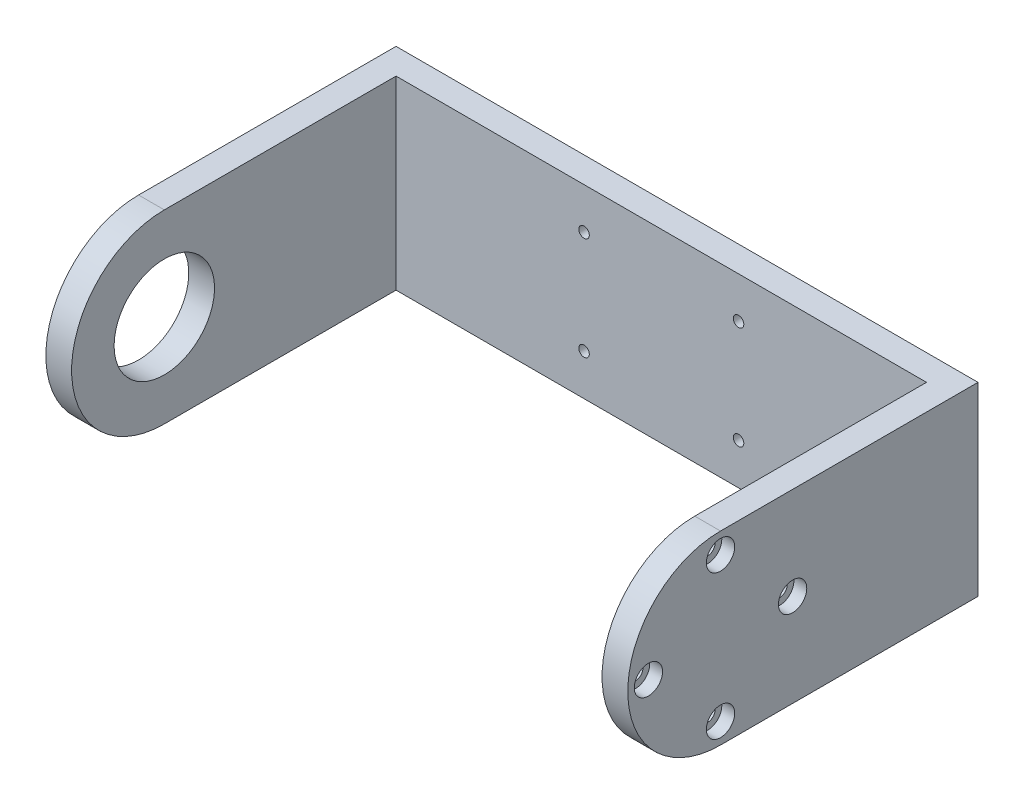
ISO-10303-21;
HEADER;
FILE_DESCRIPTION(('STEP AP214'),'2;1');
FILE_NAME('part.step','',(''),(''),'','','');
FILE_SCHEMA(('AUTOMOTIVE_DESIGN { 1 0 10303 214 1 1 1 1 }'));
ENDSEC;
DATA;
#1=APPLICATION_CONTEXT('core data for automotive mechanical design processes');
#2=APPLICATION_PROTOCOL_DEFINITION('international standard','automotive_design',2000,#1);
#3=PRODUCT_CONTEXT('',#1,'mechanical');
#4=PRODUCT('Part','Part','',(#3));
#5=PRODUCT_RELATED_PRODUCT_CATEGORY('part','',(#4));
#6=PRODUCT_DEFINITION_FORMATION('','',#4);
#7=PRODUCT_DEFINITION_CONTEXT('part definition',#1,'design');
#8=PRODUCT_DEFINITION('design','',#6,#7);
#9=PRODUCT_DEFINITION_SHAPE('','',#8);
#10=(LENGTH_UNIT() NAMED_UNIT(*) SI_UNIT(.MILLI.,.METRE.));
#11=(NAMED_UNIT(*) PLANE_ANGLE_UNIT() SI_UNIT($,.RADIAN.));
#12=(NAMED_UNIT(*) SI_UNIT($,.STERADIAN.) SOLID_ANGLE_UNIT());
#13=UNCERTAINTY_MEASURE_WITH_UNIT(LENGTH_MEASURE(1.E-05),#10,'distance_accuracy_value','');
#14=(GEOMETRIC_REPRESENTATION_CONTEXT(3) GLOBAL_UNCERTAINTY_ASSIGNED_CONTEXT((#13)) GLOBAL_UNIT_ASSIGNED_CONTEXT((#10,
#11,#12)) REPRESENTATION_CONTEXT('',''));
#15=CARTESIAN_POINT('',(0.,0.,0.));
#16=DIRECTION('',(0.,0.,1.));
#17=DIRECTION('',(1.,0.,0.));
#18=AXIS2_PLACEMENT_3D('',#15,#16,#17);
#19=CARTESIAN_POINT('',(0.,0.,-45.));
#20=DIRECTION('',(0.,0.,1.));
#21=DIRECTION('',(1.,0.,0.));
#22=AXIS2_PLACEMENT_3D('',#19,#20,#21);
#23=PLANE('',#22);
#24=CARTESIAN_POINT('',(-36.5,10.,-45.));
#25=DIRECTION('',(0.,0.,1.));
#26=DIRECTION('',(1.,0.,0.));
#27=AXIS2_PLACEMENT_3D('',#24,#25,#26);
#28=CIRCLE('',#27,1.02499999999999);
#29=CARTESIAN_POINT('',(-35.475,10.,-45.));
#30=VERTEX_POINT('',#29);
#31=EDGE_CURVE('E216',#30,#30,#28,.T.);
#32=ORIENTED_EDGE('',*,*,#31,.F.);
#33=EDGE_LOOP('',(#32));
#34=FACE_BOUND('',#33,.T.);
#35=CARTESIAN_POINT('',(-66.5,10.,-45.));
#36=DIRECTION('',(0.,0.,1.));
#37=DIRECTION('',(1.,0.,0.));
#38=AXIS2_PLACEMENT_3D('',#35,#36,#37);
#39=CIRCLE('',#38,1.025);
#40=CARTESIAN_POINT('',(-65.475,10.,-45.));
#41=VERTEX_POINT('',#40);
#42=EDGE_CURVE('E210',#41,#41,#39,.T.);
#43=ORIENTED_EDGE('',*,*,#42,.F.);
#44=EDGE_LOOP('',(#43));
#45=FACE_BOUND('',#44,.T.);
#46=CARTESIAN_POINT('',(-66.5,-10.,-45.));
#47=DIRECTION('',(0.,0.,1.));
#48=DIRECTION('',(1.,0.,0.));
#49=AXIS2_PLACEMENT_3D('',#46,#47,#48);
#50=CIRCLE('',#49,1.025);
#51=CARTESIAN_POINT('',(-65.475,-10.,-45.));
#52=VERTEX_POINT('',#51);
#53=EDGE_CURVE('E204',#52,#52,#50,.T.);
#54=ORIENTED_EDGE('',*,*,#53,.F.);
#55=EDGE_LOOP('',(#54));
#56=FACE_BOUND('',#55,.T.);
#57=CARTESIAN_POINT('',(-36.5,-10.,-45.));
#58=DIRECTION('',(0.,0.,1.));
#59=DIRECTION('',(1.,0.,0.));
#60=AXIS2_PLACEMENT_3D('',#57,#58,#59);
#61=CIRCLE('',#60,1.02499999999999);
#62=CARTESIAN_POINT('',(-35.475,-10.,-45.));
#63=VERTEX_POINT('',#62);
#64=EDGE_CURVE('E196',#63,#63,#61,.T.);
#65=ORIENTED_EDGE('',*,*,#64,.F.);
#66=EDGE_LOOP('',(#65));
#67=FACE_BOUND('',#66,.T.);
#68=DIRECTION('',(1.,0.,0.));
#69=VECTOR('',#68,1.);
#70=CARTESIAN_POINT('',(5.,18.,-45.));
#71=LINE('',#70,#69);
#72=CARTESIAN_POINT('',(-103.,18.,-45.));
#73=VERTEX_POINT('',#72);
#74=CARTESIAN_POINT('',(0.,18.,-45.));
#75=VERTEX_POINT('',#74);
#76=EDGE_CURVE('E95',#73,#75,#71,.T.);
#77=ORIENTED_EDGE('',*,*,#76,.F.);
#78=DIRECTION('',(0.,-1.,0.));
#79=VECTOR('',#78,1.);
#80=CARTESIAN_POINT('',(-103.,0.,-45.));
#81=LINE('',#80,#79);
#82=CARTESIAN_POINT('',(-103.,-18.,-45.));
#83=VERTEX_POINT('',#82);
#84=EDGE_CURVE('E163',#73,#83,#81,.T.);
#85=ORIENTED_EDGE('',*,*,#84,.T.);
#86=DIRECTION('',(-1.,0.,0.));
#87=VECTOR('',#86,1.);
#88=CARTESIAN_POINT('',(5.,-18.,-45.));
#89=LINE('',#88,#87);
#90=CARTESIAN_POINT('',(0.,-18.,-45.));
#91=VERTEX_POINT('',#90);
#92=EDGE_CURVE('E72',#91,#83,#89,.T.);
#93=ORIENTED_EDGE('',*,*,#92,.F.);
#94=DIRECTION('',(0.,-1.,0.));
#95=VECTOR('',#94,1.);
#96=CARTESIAN_POINT('',(0.,18.,-45.));
#97=LINE('',#96,#95);
#98=EDGE_CURVE('E96',#75,#91,#97,.T.);
#99=ORIENTED_EDGE('',*,*,#98,.F.);
#100=EDGE_LOOP('',(#77,#85,#93,#99));
#101=FACE_BOUND('',#100,.T.);
#102=ADVANCED_FACE('F42',(#34,#45,#56,#67,#101),#23,.T.);
#103=CARTESIAN_POINT('',(5.,0.,0.));
#104=DIRECTION('',(-1.,0.,0.));
#105=DIRECTION('',(0.,0.,1.));
#106=AXIS2_PLACEMENT_3D('',#103,#104,#105);
#107=CYLINDRICAL_SURFACE('',#106,18.);
#108=CARTESIAN_POINT('',(0.,0.,0.));
#109=DIRECTION('',(1.,0.,0.));
#110=DIRECTION('',(0.,0.,-1.));
#111=AXIS2_PLACEMENT_3D('',#108,#109,#110);
#112=CIRCLE('',#111,18.);
#113=CARTESIAN_POINT('',(0.,18.,0.));
#114=VERTEX_POINT('',#113);
#115=CARTESIAN_POINT('',(0.,-18.,0.));
#116=VERTEX_POINT('',#115);
#117=EDGE_CURVE('E78',#114,#116,#112,.T.);
#118=ORIENTED_EDGE('',*,*,#117,.T.);
#119=DIRECTION('',(-1.,0.,0.));
#120=VECTOR('',#119,1.);
#121=CARTESIAN_POINT('',(5.,-18.,0.));
#122=LINE('',#121,#120);
#123=CARTESIAN_POINT('',(5.,-18.,0.));
#124=VERTEX_POINT('',#123);
#125=EDGE_CURVE('E11',#124,#116,#122,.T.);
#126=ORIENTED_EDGE('',*,*,#125,.F.);
#127=CARTESIAN_POINT('',(5.,0.,0.));
#128=DIRECTION('',(1.,0.,0.));
#129=DIRECTION('',(0.,0.,-1.));
#130=AXIS2_PLACEMENT_3D('',#127,#128,#129);
#131=CIRCLE('',#130,18.);
#132=CARTESIAN_POINT('',(5.,18.,0.));
#133=VERTEX_POINT('',#132);
#134=EDGE_CURVE('E80',#133,#124,#131,.T.);
#135=ORIENTED_EDGE('',*,*,#134,.F.);
#136=DIRECTION('',(-1.,0.,0.));
#137=VECTOR('',#136,1.);
#138=CARTESIAN_POINT('',(5.,18.,0.));
#139=LINE('',#138,#137);
#140=EDGE_CURVE('E51',#133,#114,#139,.T.);
#141=ORIENTED_EDGE('',*,*,#140,.T.);
#142=EDGE_LOOP('',(#118,#126,#135,#141));
#143=FACE_BOUND('',#142,.T.);
#144=ADVANCED_FACE('F44',(#143),#107,.T.);
#145=CARTESIAN_POINT('',(5.,-18.,-45.));
#146=DIRECTION('',(0.,-1.,0.));
#147=DIRECTION('',(0.,0.,-1.));
#148=AXIS2_PLACEMENT_3D('',#145,#146,#147);
#149=PLANE('',#148);
#150=DIRECTION('',(0.,0.,1.));
#151=VECTOR('',#150,1.);
#152=CARTESIAN_POINT('',(-108.,-18.,-50.));
#153=LINE('',#152,#151);
#154=CARTESIAN_POINT('',(-108.,-18.,-50.));
#155=VERTEX_POINT('',#154);
#156=CARTESIAN_POINT('',(-108.,-18.,0.));
#157=VERTEX_POINT('',#156);
#158=EDGE_CURVE('E153',#155,#157,#153,.T.);
#159=ORIENTED_EDGE('',*,*,#158,.F.);
#160=DIRECTION('',(-1.,0.,0.));
#161=VECTOR('',#160,1.);
#162=CARTESIAN_POINT('',(5.,-18.,-50.));
#163=LINE('',#162,#161);
#164=CARTESIAN_POINT('',(5.,-18.,-50.));
#165=VERTEX_POINT('',#164);
#166=EDGE_CURVE('E169',#165,#155,#163,.T.);
#167=ORIENTED_EDGE('',*,*,#166,.F.);
#168=DIRECTION('',(0.,0.,1.));
#169=VECTOR('',#168,1.);
#170=CARTESIAN_POINT('',(5.,-18.,-45.));
#171=LINE('',#170,#169);
#172=EDGE_CURVE('E98',#165,#124,#171,.T.);
#173=ORIENTED_EDGE('',*,*,#172,.T.);
#174=ORIENTED_EDGE('',*,*,#125,.T.);
#175=DIRECTION('',(0.,0.,1.));
#176=VECTOR('',#175,1.);
#177=CARTESIAN_POINT('',(0.,-18.,-45.));
#178=LINE('',#177,#176);
#179=EDGE_CURVE('E88',#91,#116,#178,.T.);
#180=ORIENTED_EDGE('',*,*,#179,.F.);
#181=ORIENTED_EDGE('',*,*,#92,.T.);
#182=DIRECTION('',(0.,0.,1.));
#183=VECTOR('',#182,1.);
#184=CARTESIAN_POINT('',(-103.,-18.,-50.));
#185=LINE('',#184,#183);
#186=CARTESIAN_POINT('',(-103.,-18.,0.));
#187=VERTEX_POINT('',#186);
#188=EDGE_CURVE('E185',#83,#187,#185,.T.);
#189=ORIENTED_EDGE('',*,*,#188,.T.);
#190=DIRECTION('',(-1.,0.,0.));
#191=VECTOR('',#190,1.);
#192=CARTESIAN_POINT('',(-103.,-18.,0.));
#193=LINE('',#192,#191);
#194=EDGE_CURVE('E176',#187,#157,#193,.T.);
#195=ORIENTED_EDGE('',*,*,#194,.T.);
#196=EDGE_LOOP('',(#159,#167,#173,#174,#180,#181,#189,#195));
#197=FACE_BOUND('',#196,.T.);
#198=ADVANCED_FACE('F254',(#197),#149,.T.);
#199=CARTESIAN_POINT('',(5.,18.,0.));
#200=DIRECTION('',(0.,1.,0.));
#201=DIRECTION('',(0.,0.,1.));
#202=AXIS2_PLACEMENT_3D('',#199,#200,#201);
#203=PLANE('',#202);
#204=DIRECTION('',(0.,0.,-1.));
#205=VECTOR('',#204,1.);
#206=CARTESIAN_POINT('',(-103.,18.,-50.));
#207=LINE('',#206,#205);
#208=CARTESIAN_POINT('',(-103.,18.,0.));
#209=VERTEX_POINT('',#208);
#210=EDGE_CURVE('E179',#209,#73,#207,.T.);
#211=ORIENTED_EDGE('',*,*,#210,.T.);
#212=ORIENTED_EDGE('',*,*,#76,.T.);
#213=DIRECTION('',(0.,0.,-1.));
#214=VECTOR('',#213,1.);
#215=CARTESIAN_POINT('',(0.,18.,0.));
#216=LINE('',#215,#214);
#217=EDGE_CURVE('E87',#114,#75,#216,.T.);
#218=ORIENTED_EDGE('',*,*,#217,.F.);
#219=ORIENTED_EDGE('',*,*,#140,.F.);
#220=DIRECTION('',(0.,0.,-1.));
#221=VECTOR('',#220,1.);
#222=CARTESIAN_POINT('',(5.,18.,0.));
#223=LINE('',#222,#221);
#224=CARTESIAN_POINT('',(5.,18.,-50.));
#225=VERTEX_POINT('',#224);
#226=EDGE_CURVE('E82',#133,#225,#223,.T.);
#227=ORIENTED_EDGE('',*,*,#226,.T.);
#228=DIRECTION('',(1.,0.,0.));
#229=VECTOR('',#228,1.);
#230=CARTESIAN_POINT('',(5.,18.,-50.));
#231=LINE('',#230,#229);
#232=CARTESIAN_POINT('',(-108.,18.,-50.));
#233=VERTEX_POINT('',#232);
#234=EDGE_CURVE('E159',#233,#225,#231,.T.);
#235=ORIENTED_EDGE('',*,*,#234,.F.);
#236=DIRECTION('',(0.,0.,1.));
#237=VECTOR('',#236,1.);
#238=CARTESIAN_POINT('',(-108.,18.,-50.));
#239=LINE('',#238,#237);
#240=CARTESIAN_POINT('',(-108.,18.,0.));
#241=VERTEX_POINT('',#240);
#242=EDGE_CURVE('E156',#233,#241,#239,.T.);
#243=ORIENTED_EDGE('',*,*,#242,.T.);
#244=DIRECTION('',(-1.,0.,0.));
#245=VECTOR('',#244,1.);
#246=CARTESIAN_POINT('',(-103.,18.,0.));
#247=LINE('',#246,#245);
#248=EDGE_CURVE('E175',#209,#241,#247,.T.);
#249=ORIENTED_EDGE('',*,*,#248,.F.);
#250=EDGE_LOOP('',(#211,#212,#218,#219,#227,#235,#243,#249));
#251=FACE_BOUND('',#250,.T.);
#252=ADVANCED_FACE('F93',(#251),#203,.T.);
#253=CARTESIAN_POINT('',(5.,0.,0.));
#254=DIRECTION('',(1.,0.,0.));
#255=DIRECTION('',(0.,0.,-1.));
#256=AXIS2_PLACEMENT_3D('',#253,#254,#255);
#257=PLANE('',#256);
#258=CARTESIAN_POINT('',(5.,14.,0.));
#259=DIRECTION('',(1.,0.,0.));
#260=DIRECTION('',(0.,0.,-1.));
#261=AXIS2_PLACEMENT_3D('',#258,#259,#260);
#262=CIRCLE('',#261,2.75);
#263=CARTESIAN_POINT('',(5.,14.,-2.75));
#264=VERTEX_POINT('',#263);
#265=EDGE_CURVE('E150',#264,#264,#262,.T.);
#266=ORIENTED_EDGE('',*,*,#265,.F.);
#267=EDGE_LOOP('',(#266));
#268=FACE_BOUND('',#267,.T.);
#269=CARTESIAN_POINT('',(5.,0.,-14.));
#270=DIRECTION('',(1.,0.,0.));
#271=DIRECTION('',(0.,0.,-1.));
#272=AXIS2_PLACEMENT_3D('',#269,#270,#271);
#273=CIRCLE('',#272,2.75);
#274=CARTESIAN_POINT('',(5.,0.,-16.75));
#275=VERTEX_POINT('',#274);
#276=EDGE_CURVE('E138',#275,#275,#273,.T.);
#277=ORIENTED_EDGE('',*,*,#276,.F.);
#278=EDGE_LOOP('',(#277));
#279=FACE_BOUND('',#278,.T.);
#280=CARTESIAN_POINT('',(5.,-14.,0.));
#281=DIRECTION('',(1.,0.,0.));
#282=DIRECTION('',(0.,0.,-1.));
#283=AXIS2_PLACEMENT_3D('',#280,#281,#282);
#284=CIRCLE('',#283,2.75);
#285=CARTESIAN_POINT('',(5.,-14.,-2.75));
#286=VERTEX_POINT('',#285);
#287=EDGE_CURVE('E126',#286,#286,#284,.T.);
#288=ORIENTED_EDGE('',*,*,#287,.F.);
#289=EDGE_LOOP('',(#288));
#290=FACE_BOUND('',#289,.T.);
#291=CARTESIAN_POINT('',(5.,0.,14.));
#292=DIRECTION('',(1.,0.,0.));
#293=DIRECTION('',(0.,0.,-1.));
#294=AXIS2_PLACEMENT_3D('',#291,#292,#293);
#295=CIRCLE('',#294,2.75);
#296=CARTESIAN_POINT('',(5.,0.,11.25));
#297=VERTEX_POINT('',#296);
#298=EDGE_CURVE('E114',#297,#297,#295,.T.);
#299=ORIENTED_EDGE('',*,*,#298,.F.);
#300=EDGE_LOOP('',(#299));
#301=FACE_BOUND('',#300,.T.);
#302=ORIENTED_EDGE('',*,*,#134,.T.);
#303=ORIENTED_EDGE('',*,*,#172,.F.);
#304=DIRECTION('',(0.,-1.,0.));
#305=VECTOR('',#304,1.);
#306=CARTESIAN_POINT('',(5.,-18.,-50.));
#307=LINE('',#306,#305);
#308=EDGE_CURVE('E161',#225,#165,#307,.T.);
#309=ORIENTED_EDGE('',*,*,#308,.F.);
#310=ORIENTED_EDGE('',*,*,#226,.F.);
#311=EDGE_LOOP('',(#302,#303,#309,#310));
#312=FACE_BOUND('',#311,.T.);
#313=ADVANCED_FACE('F247',(#268,#279,#290,#301,#312),#257,.T.);
#314=CARTESIAN_POINT('',(0.,0.,0.));
#315=DIRECTION('',(1.,0.,0.));
#316=DIRECTION('',(0.,0.,-1.));
#317=AXIS2_PLACEMENT_3D('',#314,#315,#316);
#318=PLANE('',#317);
#319=CARTESIAN_POINT('',(0.,14.,0.));
#320=DIRECTION('',(1.,0.,0.));
#321=DIRECTION('',(0.,0.,-1.));
#322=AXIS2_PLACEMENT_3D('',#319,#320,#321);
#323=CIRCLE('',#322,1.45);
#324=CARTESIAN_POINT('',(0.,14.,-1.45));
#325=VERTEX_POINT('',#324);
#326=EDGE_CURVE('E141',#325,#325,#323,.T.);
#327=ORIENTED_EDGE('',*,*,#326,.T.);
#328=EDGE_LOOP('',(#327));
#329=FACE_BOUND('',#328,.T.);
#330=CARTESIAN_POINT('',(0.,0.,-14.));
#331=DIRECTION('',(1.,0.,0.));
#332=DIRECTION('',(0.,0.,-1.));
#333=AXIS2_PLACEMENT_3D('',#330,#331,#332);
#334=CIRCLE('',#333,1.45);
#335=CARTESIAN_POINT('',(0.,0.,-15.45));
#336=VERTEX_POINT('',#335);
#337=EDGE_CURVE('E129',#336,#336,#334,.T.);
#338=ORIENTED_EDGE('',*,*,#337,.T.);
#339=EDGE_LOOP('',(#338));
#340=FACE_BOUND('',#339,.T.);
#341=CARTESIAN_POINT('',(0.,-14.,0.));
#342=DIRECTION('',(1.,0.,0.));
#343=DIRECTION('',(0.,0.,-1.));
#344=AXIS2_PLACEMENT_3D('',#341,#342,#343);
#345=CIRCLE('',#344,1.45);
#346=CARTESIAN_POINT('',(0.,-14.,-1.45));
#347=VERTEX_POINT('',#346);
#348=EDGE_CURVE('E117',#347,#347,#345,.T.);
#349=ORIENTED_EDGE('',*,*,#348,.T.);
#350=EDGE_LOOP('',(#349));
#351=FACE_BOUND('',#350,.T.);
#352=CARTESIAN_POINT('',(0.,0.,14.));
#353=DIRECTION('',(1.,0.,0.));
#354=DIRECTION('',(0.,0.,-1.));
#355=AXIS2_PLACEMENT_3D('',#352,#353,#354);
#356=CIRCLE('',#355,1.45);
#357=CARTESIAN_POINT('',(0.,0.,12.55));
#358=VERTEX_POINT('',#357);
#359=EDGE_CURVE('E89',#358,#358,#356,.T.);
#360=ORIENTED_EDGE('',*,*,#359,.T.);
#361=EDGE_LOOP('',(#360));
#362=FACE_BOUND('',#361,.T.);
#363=ORIENTED_EDGE('',*,*,#117,.F.);
#364=ORIENTED_EDGE('',*,*,#217,.T.);
#365=ORIENTED_EDGE('',*,*,#98,.T.);
#366=ORIENTED_EDGE('',*,*,#179,.T.);
#367=EDGE_LOOP('',(#363,#364,#365,#366));
#368=FACE_BOUND('',#367,.T.);
#369=ADVANCED_FACE('F85',(#329,#340,#351,#362,#368),#318,.F.);
#370=CARTESIAN_POINT('',(5.,0.,14.));
#371=DIRECTION('',(1.,0.,0.));
#372=DIRECTION('',(0.,0.,-1.));
#373=AXIS2_PLACEMENT_3D('',#370,#371,#372);
#374=CYLINDRICAL_SURFACE('',#373,1.45);
#375=ORIENTED_EDGE('',*,*,#359,.F.);
#376=EDGE_LOOP('',(#375));
#377=FACE_BOUND('',#376,.T.);
#378=CARTESIAN_POINT('',(2.5,0.,14.));
#379=DIRECTION('',(1.,0.,0.));
#380=DIRECTION('',(0.,0.,-1.));
#381=AXIS2_PLACEMENT_3D('',#378,#379,#380);
#382=CIRCLE('',#381,1.45);
#383=CARTESIAN_POINT('',(2.5,0.,12.55));
#384=VERTEX_POINT('',#383);
#385=EDGE_CURVE('E108',#384,#384,#382,.T.);
#386=ORIENTED_EDGE('',*,*,#385,.T.);
#387=EDGE_LOOP('',(#386));
#388=FACE_BOUND('',#387,.T.);
#389=ADVANCED_FACE('F336',(#377,#388),#374,.F.);
#390=CARTESIAN_POINT('',(2.5,1.45,14.));
#391=DIRECTION('',(-1.,0.,0.));
#392=DIRECTION('',(0.,0.,1.));
#393=AXIS2_PLACEMENT_3D('',#390,#391,#392);
#394=PLANE('',#393);
#395=ORIENTED_EDGE('',*,*,#385,.F.);
#396=EDGE_LOOP('',(#395));
#397=FACE_BOUND('',#396,.T.);
#398=CARTESIAN_POINT('',(2.5,0.,14.));
#399=DIRECTION('',(1.,0.,0.));
#400=DIRECTION('',(0.,0.,-1.));
#401=AXIS2_PLACEMENT_3D('',#398,#399,#400);
#402=CIRCLE('',#401,2.75);
#403=CARTESIAN_POINT('',(2.5,0.,11.25));
#404=VERTEX_POINT('',#403);
#405=EDGE_CURVE('E111',#404,#404,#402,.T.);
#406=ORIENTED_EDGE('',*,*,#405,.T.);
#407=EDGE_LOOP('',(#406));
#408=FACE_BOUND('',#407,.T.);
#409=ADVANCED_FACE('F332',(#397,#408),#394,.F.);
#410=CARTESIAN_POINT('',(5.,0.,14.));
#411=DIRECTION('',(1.,0.,0.));
#412=DIRECTION('',(0.,0.,-1.));
#413=AXIS2_PLACEMENT_3D('',#410,#411,#412);
#414=CYLINDRICAL_SURFACE('',#413,2.75);
#415=ORIENTED_EDGE('',*,*,#405,.F.);
#416=EDGE_LOOP('',(#415));
#417=FACE_BOUND('',#416,.T.);
#418=ORIENTED_EDGE('',*,*,#298,.T.);
#419=EDGE_LOOP('',(#418));
#420=FACE_BOUND('',#419,.T.);
#421=ADVANCED_FACE('F328',(#417,#420),#414,.F.);
#422=CARTESIAN_POINT('',(5.,-14.,0.));
#423=DIRECTION('',(1.,0.,0.));
#424=DIRECTION('',(0.,0.,-1.));
#425=AXIS2_PLACEMENT_3D('',#422,#423,#424);
#426=CYLINDRICAL_SURFACE('',#425,1.45);
#427=ORIENTED_EDGE('',*,*,#348,.F.);
#428=EDGE_LOOP('',(#427));
#429=FACE_BOUND('',#428,.T.);
#430=CARTESIAN_POINT('',(2.5,-14.,0.));
#431=DIRECTION('',(1.,0.,0.));
#432=DIRECTION('',(0.,0.,-1.));
#433=AXIS2_PLACEMENT_3D('',#430,#431,#432);
#434=CIRCLE('',#433,1.45);
#435=CARTESIAN_POINT('',(2.5,-14.,-1.45));
#436=VERTEX_POINT('',#435);
#437=EDGE_CURVE('E120',#436,#436,#434,.T.);
#438=ORIENTED_EDGE('',*,*,#437,.T.);
#439=EDGE_LOOP('',(#438));
#440=FACE_BOUND('',#439,.T.);
#441=ADVANCED_FACE('F324',(#429,#440),#426,.F.);
#442=CARTESIAN_POINT('',(2.5,-12.55,0.));
#443=DIRECTION('',(-1.,0.,0.));
#444=DIRECTION('',(0.,0.,1.));
#445=AXIS2_PLACEMENT_3D('',#442,#443,#444);
#446=PLANE('',#445);
#447=ORIENTED_EDGE('',*,*,#437,.F.);
#448=EDGE_LOOP('',(#447));
#449=FACE_BOUND('',#448,.T.);
#450=CARTESIAN_POINT('',(2.5,-14.,0.));
#451=DIRECTION('',(1.,0.,0.));
#452=DIRECTION('',(0.,0.,-1.));
#453=AXIS2_PLACEMENT_3D('',#450,#451,#452);
#454=CIRCLE('',#453,2.75);
#455=CARTESIAN_POINT('',(2.5,-14.,-2.75));
#456=VERTEX_POINT('',#455);
#457=EDGE_CURVE('E123',#456,#456,#454,.T.);
#458=ORIENTED_EDGE('',*,*,#457,.T.);
#459=EDGE_LOOP('',(#458));
#460=FACE_BOUND('',#459,.T.);
#461=ADVANCED_FACE('F320',(#449,#460),#446,.F.);
#462=CARTESIAN_POINT('',(5.,-14.,0.));
#463=DIRECTION('',(1.,0.,0.));
#464=DIRECTION('',(0.,0.,-1.));
#465=AXIS2_PLACEMENT_3D('',#462,#463,#464);
#466=CYLINDRICAL_SURFACE('',#465,2.75);
#467=ORIENTED_EDGE('',*,*,#457,.F.);
#468=EDGE_LOOP('',(#467));
#469=FACE_BOUND('',#468,.T.);
#470=ORIENTED_EDGE('',*,*,#287,.T.);
#471=EDGE_LOOP('',(#470));
#472=FACE_BOUND('',#471,.T.);
#473=ADVANCED_FACE('F316',(#469,#472),#466,.F.);
#474=CARTESIAN_POINT('',(5.,0.,-14.));
#475=DIRECTION('',(1.,0.,0.));
#476=DIRECTION('',(0.,0.,-1.));
#477=AXIS2_PLACEMENT_3D('',#474,#475,#476);
#478=CYLINDRICAL_SURFACE('',#477,1.45);
#479=ORIENTED_EDGE('',*,*,#337,.F.);
#480=EDGE_LOOP('',(#479));
#481=FACE_BOUND('',#480,.T.);
#482=CARTESIAN_POINT('',(2.5,0.,-14.));
#483=DIRECTION('',(1.,0.,0.));
#484=DIRECTION('',(0.,0.,-1.));
#485=AXIS2_PLACEMENT_3D('',#482,#483,#484);
#486=CIRCLE('',#485,1.45);
#487=CARTESIAN_POINT('',(2.5,0.,-15.45));
#488=VERTEX_POINT('',#487);
#489=EDGE_CURVE('E132',#488,#488,#486,.T.);
#490=ORIENTED_EDGE('',*,*,#489,.T.);
#491=EDGE_LOOP('',(#490));
#492=FACE_BOUND('',#491,.T.);
#493=ADVANCED_FACE('F312',(#481,#492),#478,.F.);
#494=CARTESIAN_POINT('',(2.5,1.45,-14.));
#495=DIRECTION('',(-1.,0.,0.));
#496=DIRECTION('',(0.,0.,1.));
#497=AXIS2_PLACEMENT_3D('',#494,#495,#496);
#498=PLANE('',#497);
#499=ORIENTED_EDGE('',*,*,#489,.F.);
#500=EDGE_LOOP('',(#499));
#501=FACE_BOUND('',#500,.T.);
#502=CARTESIAN_POINT('',(2.5,0.,-14.));
#503=DIRECTION('',(1.,0.,0.));
#504=DIRECTION('',(0.,0.,-1.));
#505=AXIS2_PLACEMENT_3D('',#502,#503,#504);
#506=CIRCLE('',#505,2.75);
#507=CARTESIAN_POINT('',(2.5,0.,-16.75));
#508=VERTEX_POINT('',#507);
#509=EDGE_CURVE('E135',#508,#508,#506,.T.);
#510=ORIENTED_EDGE('',*,*,#509,.T.);
#511=EDGE_LOOP('',(#510));
#512=FACE_BOUND('',#511,.T.);
#513=ADVANCED_FACE('F308',(#501,#512),#498,.F.);
#514=CARTESIAN_POINT('',(5.,0.,-14.));
#515=DIRECTION('',(1.,0.,0.));
#516=DIRECTION('',(0.,0.,-1.));
#517=AXIS2_PLACEMENT_3D('',#514,#515,#516);
#518=CYLINDRICAL_SURFACE('',#517,2.75);
#519=ORIENTED_EDGE('',*,*,#509,.F.);
#520=EDGE_LOOP('',(#519));
#521=FACE_BOUND('',#520,.T.);
#522=ORIENTED_EDGE('',*,*,#276,.T.);
#523=EDGE_LOOP('',(#522));
#524=FACE_BOUND('',#523,.T.);
#525=ADVANCED_FACE('F304',(#521,#524),#518,.F.);
#526=CARTESIAN_POINT('',(5.,14.,0.));
#527=DIRECTION('',(1.,0.,0.));
#528=DIRECTION('',(0.,0.,-1.));
#529=AXIS2_PLACEMENT_3D('',#526,#527,#528);
#530=CYLINDRICAL_SURFACE('',#529,1.45);
#531=ORIENTED_EDGE('',*,*,#326,.F.);
#532=EDGE_LOOP('',(#531));
#533=FACE_BOUND('',#532,.T.);
#534=CARTESIAN_POINT('',(2.5,14.,0.));
#535=DIRECTION('',(1.,0.,0.));
#536=DIRECTION('',(0.,0.,-1.));
#537=AXIS2_PLACEMENT_3D('',#534,#535,#536);
#538=CIRCLE('',#537,1.45);
#539=CARTESIAN_POINT('',(2.5,14.,-1.45));
#540=VERTEX_POINT('',#539);
#541=EDGE_CURVE('E144',#540,#540,#538,.T.);
#542=ORIENTED_EDGE('',*,*,#541,.T.);
#543=EDGE_LOOP('',(#542));
#544=FACE_BOUND('',#543,.T.);
#545=ADVANCED_FACE('F300',(#533,#544),#530,.F.);
#546=CARTESIAN_POINT('',(2.5,15.45,0.));
#547=DIRECTION('',(-1.,0.,0.));
#548=DIRECTION('',(0.,0.,1.));
#549=AXIS2_PLACEMENT_3D('',#546,#547,#548);
#550=PLANE('',#549);
#551=ORIENTED_EDGE('',*,*,#541,.F.);
#552=EDGE_LOOP('',(#551));
#553=FACE_BOUND('',#552,.T.);
#554=CARTESIAN_POINT('',(2.5,14.,0.));
#555=DIRECTION('',(1.,0.,0.));
#556=DIRECTION('',(0.,0.,-1.));
#557=AXIS2_PLACEMENT_3D('',#554,#555,#556);
#558=CIRCLE('',#557,2.75);
#559=CARTESIAN_POINT('',(2.5,14.,-2.75));
#560=VERTEX_POINT('',#559);
#561=EDGE_CURVE('E147',#560,#560,#558,.T.);
#562=ORIENTED_EDGE('',*,*,#561,.T.);
#563=EDGE_LOOP('',(#562));
#564=FACE_BOUND('',#563,.T.);
#565=ADVANCED_FACE('F296',(#553,#564),#550,.F.);
#566=CARTESIAN_POINT('',(5.,14.,0.));
#567=DIRECTION('',(1.,0.,0.));
#568=DIRECTION('',(0.,0.,-1.));
#569=AXIS2_PLACEMENT_3D('',#566,#567,#568);
#570=CYLINDRICAL_SURFACE('',#569,2.75);
#571=ORIENTED_EDGE('',*,*,#561,.F.);
#572=EDGE_LOOP('',(#571));
#573=FACE_BOUND('',#572,.T.);
#574=ORIENTED_EDGE('',*,*,#265,.T.);
#575=EDGE_LOOP('',(#574));
#576=FACE_BOUND('',#575,.T.);
#577=ADVANCED_FACE('F292',(#573,#576),#570,.F.);
#578=CARTESIAN_POINT('',(-108.,-18.,-50.));
#579=DIRECTION('',(1.,0.,0.));
#580=DIRECTION('',(0.,0.,-1.));
#581=AXIS2_PLACEMENT_3D('',#578,#579,#580);
#582=PLANE('',#581);
#583=CARTESIAN_POINT('',(-108.,0.,0.));
#584=DIRECTION('',(-1.,0.,0.));
#585=DIRECTION('',(0.,0.,1.));
#586=AXIS2_PLACEMENT_3D('',#583,#584,#585);
#587=CIRCLE('',#586,9.75);
#588=CARTESIAN_POINT('',(-108.,0.,9.75));
#589=VERTEX_POINT('',#588);
#590=EDGE_CURVE('E193',#589,#589,#587,.T.);
#591=ORIENTED_EDGE('',*,*,#590,.F.);
#592=EDGE_LOOP('',(#591));
#593=FACE_BOUND('',#592,.T.);
#594=ORIENTED_EDGE('',*,*,#158,.T.);
#595=CARTESIAN_POINT('',(-108.,0.,0.));
#596=DIRECTION('',(-1.,0.,0.));
#597=DIRECTION('',(0.,0.,1.));
#598=AXIS2_PLACEMENT_3D('',#595,#596,#597);
#599=CIRCLE('',#598,18.);
#600=EDGE_CURVE('E182',#157,#241,#599,.T.);
#601=ORIENTED_EDGE('',*,*,#600,.T.);
#602=ORIENTED_EDGE('',*,*,#242,.F.);
#603=DIRECTION('',(0.,1.,0.));
#604=VECTOR('',#603,1.);
#605=CARTESIAN_POINT('',(-108.,-18.,-50.));
#606=LINE('',#605,#604);
#607=EDGE_CURVE('E166',#155,#233,#606,.T.);
#608=ORIENTED_EDGE('',*,*,#607,.F.);
#609=EDGE_LOOP('',(#594,#601,#602,#608));
#610=FACE_BOUND('',#609,.T.);
#611=ADVANCED_FACE('F229',(#593,#610),#582,.F.);
#612=CARTESIAN_POINT('',(0.,0.,-50.));
#613=DIRECTION('',(0.,0.,1.));
#614=DIRECTION('',(1.,0.,0.));
#615=AXIS2_PLACEMENT_3D('',#612,#613,#614);
#616=PLANE('',#615);
#617=CARTESIAN_POINT('',(-36.5,10.,-50.));
#618=DIRECTION('',(0.,0.,-1.));
#619=DIRECTION('',(-1.,0.,0.));
#620=AXIS2_PLACEMENT_3D('',#617,#618,#619);
#621=CIRCLE('',#620,1.025);
#622=CARTESIAN_POINT('',(-37.525,10.,-50.));
#623=VERTEX_POINT('',#622);
#624=EDGE_CURVE('E219',#623,#623,#621,.T.);
#625=ORIENTED_EDGE('',*,*,#624,.F.);
#626=EDGE_LOOP('',(#625));
#627=FACE_BOUND('',#626,.T.);
#628=CARTESIAN_POINT('',(-66.5,10.,-50.));
#629=DIRECTION('',(0.,0.,-1.));
#630=DIRECTION('',(-1.,0.,0.));
#631=AXIS2_PLACEMENT_3D('',#628,#629,#630);
#632=CIRCLE('',#631,1.025);
#633=CARTESIAN_POINT('',(-67.525,10.,-50.));
#634=VERTEX_POINT('',#633);
#635=EDGE_CURVE('E213',#634,#634,#632,.T.);
#636=ORIENTED_EDGE('',*,*,#635,.F.);
#637=EDGE_LOOP('',(#636));
#638=FACE_BOUND('',#637,.T.);
#639=CARTESIAN_POINT('',(-66.5,-10.,-50.));
#640=DIRECTION('',(0.,0.,-1.));
#641=DIRECTION('',(-1.,0.,0.));
#642=AXIS2_PLACEMENT_3D('',#639,#640,#641);
#643=CIRCLE('',#642,1.025);
#644=CARTESIAN_POINT('',(-67.525,-10.,-50.));
#645=VERTEX_POINT('',#644);
#646=EDGE_CURVE('E207',#645,#645,#643,.T.);
#647=ORIENTED_EDGE('',*,*,#646,.F.);
#648=EDGE_LOOP('',(#647));
#649=FACE_BOUND('',#648,.T.);
#650=CARTESIAN_POINT('',(-36.5,-10.,-50.));
#651=DIRECTION('',(0.,0.,-1.));
#652=DIRECTION('',(-1.,0.,0.));
#653=AXIS2_PLACEMENT_3D('',#650,#651,#652);
#654=CIRCLE('',#653,1.025);
#655=CARTESIAN_POINT('',(-37.525,-10.,-50.));
#656=VERTEX_POINT('',#655);
#657=EDGE_CURVE('E201',#656,#656,#654,.T.);
#658=ORIENTED_EDGE('',*,*,#657,.F.);
#659=EDGE_LOOP('',(#658));
#660=FACE_BOUND('',#659,.T.);
#661=ORIENTED_EDGE('',*,*,#234,.T.);
#662=ORIENTED_EDGE('',*,*,#308,.T.);
#663=ORIENTED_EDGE('',*,*,#166,.T.);
#664=ORIENTED_EDGE('',*,*,#607,.T.);
#665=EDGE_LOOP('',(#661,#662,#663,#664));
#666=FACE_BOUND('',#665,.T.);
#667=ADVANCED_FACE('F225',(#627,#638,#649,#660,#666),#616,.F.);
#668=CARTESIAN_POINT('',(-103.,0.,0.));
#669=DIRECTION('',(-1.,0.,0.));
#670=DIRECTION('',(0.,0.,1.));
#671=AXIS2_PLACEMENT_3D('',#668,#669,#670);
#672=CYLINDRICAL_SURFACE('',#671,18.);
#673=ORIENTED_EDGE('',*,*,#600,.F.);
#674=ORIENTED_EDGE('',*,*,#194,.F.);
#675=CARTESIAN_POINT('',(-103.,0.,0.));
#676=DIRECTION('',(-1.,0.,0.));
#677=DIRECTION('',(0.,0.,1.));
#678=AXIS2_PLACEMENT_3D('',#675,#676,#677);
#679=CIRCLE('',#678,18.);
#680=EDGE_CURVE('E188',#187,#209,#679,.T.);
#681=ORIENTED_EDGE('',*,*,#680,.T.);
#682=ORIENTED_EDGE('',*,*,#248,.T.);
#683=EDGE_LOOP('',(#673,#674,#681,#682));
#684=FACE_BOUND('',#683,.T.);
#685=ADVANCED_FACE('F228',(#684),#672,.T.);
#686=CARTESIAN_POINT('',(-103.,0.,0.));
#687=DIRECTION('',(-1.,0.,0.));
#688=DIRECTION('',(0.,0.,1.));
#689=AXIS2_PLACEMENT_3D('',#686,#687,#688);
#690=PLANE('',#689);
#691=CARTESIAN_POINT('',(-103.,0.,0.));
#692=DIRECTION('',(-1.,0.,0.));
#693=DIRECTION('',(0.,0.,1.));
#694=AXIS2_PLACEMENT_3D('',#691,#692,#693);
#695=CIRCLE('',#694,9.75);
#696=CARTESIAN_POINT('',(-103.,0.,9.75));
#697=VERTEX_POINT('',#696);
#698=EDGE_CURVE('E186',#697,#697,#695,.T.);
#699=ORIENTED_EDGE('',*,*,#698,.T.);
#700=EDGE_LOOP('',(#699));
#701=FACE_BOUND('',#700,.T.);
#702=ORIENTED_EDGE('',*,*,#84,.F.);
#703=ORIENTED_EDGE('',*,*,#210,.F.);
#704=ORIENTED_EDGE('',*,*,#680,.F.);
#705=ORIENTED_EDGE('',*,*,#188,.F.);
#706=EDGE_LOOP('',(#702,#703,#704,#705));
#707=FACE_BOUND('',#706,.T.);
#708=ADVANCED_FACE('F277',(#701,#707),#690,.F.);
#709=CARTESIAN_POINT('',(-103.,0.,0.));
#710=DIRECTION('',(-1.,0.,0.));
#711=DIRECTION('',(0.,0.,1.));
#712=AXIS2_PLACEMENT_3D('',#709,#710,#711);
#713=CYLINDRICAL_SURFACE('',#712,9.75);
#714=ORIENTED_EDGE('',*,*,#698,.F.);
#715=EDGE_LOOP('',(#714));
#716=FACE_BOUND('',#715,.T.);
#717=ORIENTED_EDGE('',*,*,#590,.T.);
#718=EDGE_LOOP('',(#717));
#719=FACE_BOUND('',#718,.T.);
#720=ADVANCED_FACE('F438',(#716,#719),#713,.F.);
#721=CARTESIAN_POINT('',(-36.5,-10.,-50.));
#722=DIRECTION('',(0.,0.,-1.));
#723=DIRECTION('',(-1.,0.,0.));
#724=AXIS2_PLACEMENT_3D('',#721,#722,#723);
#725=CYLINDRICAL_SURFACE('',#724,1.02499999999999);
#726=ORIENTED_EDGE('',*,*,#64,.T.);
#727=EDGE_LOOP('',(#726));
#728=FACE_BOUND('',#727,.T.);
#729=ORIENTED_EDGE('',*,*,#657,.T.);
#730=EDGE_LOOP('',(#729));
#731=FACE_BOUND('',#730,.T.);
#732=ADVANCED_FACE('F445',(#728,#731),#725,.F.);
#733=CARTESIAN_POINT('',(-66.5,-10.,-50.));
#734=DIRECTION('',(0.,0.,-1.));
#735=DIRECTION('',(-1.,0.,0.));
#736=AXIS2_PLACEMENT_3D('',#733,#734,#735);
#737=CYLINDRICAL_SURFACE('',#736,1.025);
#738=ORIENTED_EDGE('',*,*,#53,.T.);
#739=EDGE_LOOP('',(#738));
#740=FACE_BOUND('',#739,.T.);
#741=ORIENTED_EDGE('',*,*,#646,.T.);
#742=EDGE_LOOP('',(#741));
#743=FACE_BOUND('',#742,.T.);
#744=ADVANCED_FACE('F453',(#740,#743),#737,.F.);
#745=CARTESIAN_POINT('',(-66.5,10.,-50.));
#746=DIRECTION('',(0.,0.,-1.));
#747=DIRECTION('',(-1.,0.,0.));
#748=AXIS2_PLACEMENT_3D('',#745,#746,#747);
#749=CYLINDRICAL_SURFACE('',#748,1.025);
#750=ORIENTED_EDGE('',*,*,#42,.T.);
#751=EDGE_LOOP('',(#750));
#752=FACE_BOUND('',#751,.T.);
#753=ORIENTED_EDGE('',*,*,#635,.T.);
#754=EDGE_LOOP('',(#753));
#755=FACE_BOUND('',#754,.T.);
#756=ADVANCED_FACE('F461',(#752,#755),#749,.F.);
#757=CARTESIAN_POINT('',(-36.5,10.,-50.));
#758=DIRECTION('',(0.,0.,-1.));
#759=DIRECTION('',(-1.,0.,0.));
#760=AXIS2_PLACEMENT_3D('',#757,#758,#759);
#761=CYLINDRICAL_SURFACE('',#760,1.02499999999999);
#762=ORIENTED_EDGE('',*,*,#31,.T.);
#763=EDGE_LOOP('',(#762));
#764=FACE_BOUND('',#763,.T.);
#765=ORIENTED_EDGE('',*,*,#624,.T.);
#766=EDGE_LOOP('',(#765));
#767=FACE_BOUND('',#766,.T.);
#768=ADVANCED_FACE('F223',(#764,#767),#761,.F.);
#769=CLOSED_SHELL('',(#102,#144,#198,#252,#313,#369,#389,#409,#421,#441,#461,#473,#493,#513,
#525,#545,#565,#577,#611,#667,#685,#708,#720,#732,#744,#756,#768));
#770=MANIFOLD_SOLID_BREP('B2',#769);
#771=ADVANCED_BREP_SHAPE_REPRESENTATION('',(#18,#770),#14);
#772=SHAPE_DEFINITION_REPRESENTATION(#9,#771);
ENDSEC;
END-ISO-10303-21;
